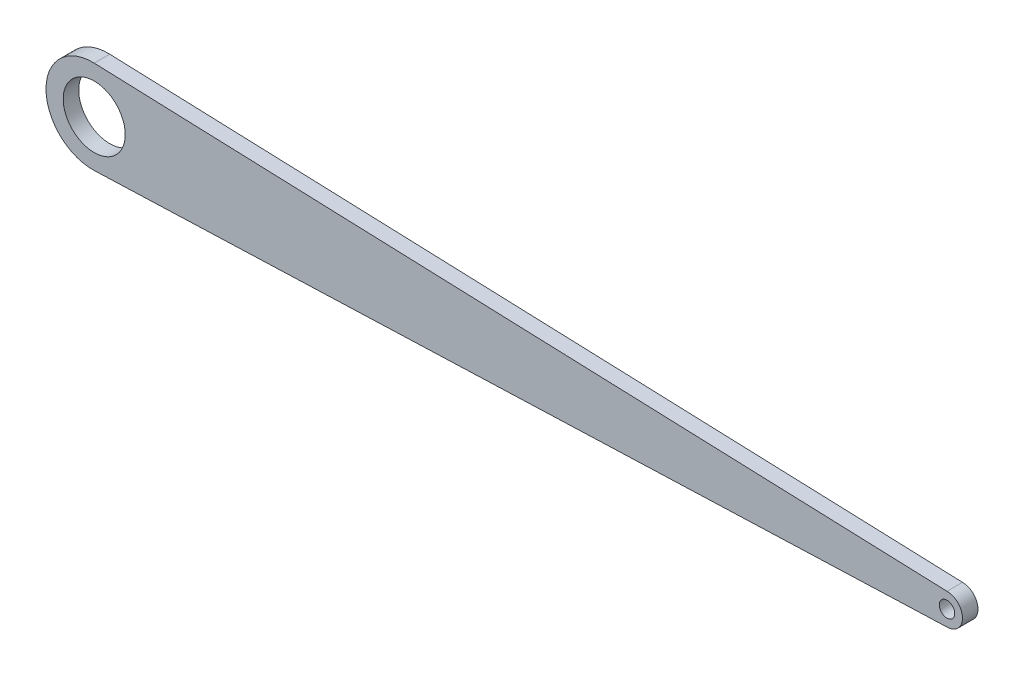
ISO-10303-21;
HEADER;
FILE_DESCRIPTION(('STEP AP214'),'2;1');
FILE_NAME('part.step','',(''),(''),'','','');
FILE_SCHEMA(('AUTOMOTIVE_DESIGN { 1 0 10303 214 1 1 1 1 }'));
ENDSEC;
DATA;
#1=APPLICATION_CONTEXT('core data for automotive mechanical design processes');
#2=APPLICATION_PROTOCOL_DEFINITION('international standard','automotive_design',2000,#1);
#3=PRODUCT_CONTEXT('',#1,'mechanical');
#4=PRODUCT('Part','Part','',(#3));
#5=PRODUCT_RELATED_PRODUCT_CATEGORY('part','',(#4));
#6=PRODUCT_DEFINITION_FORMATION('','',#4);
#7=PRODUCT_DEFINITION_CONTEXT('part definition',#1,'design');
#8=PRODUCT_DEFINITION('design','',#6,#7);
#9=PRODUCT_DEFINITION_SHAPE('','',#8);
#10=(LENGTH_UNIT() NAMED_UNIT(*) SI_UNIT(.MILLI.,.METRE.));
#11=(NAMED_UNIT(*) PLANE_ANGLE_UNIT() SI_UNIT($,.RADIAN.));
#12=(NAMED_UNIT(*) SI_UNIT($,.STERADIAN.) SOLID_ANGLE_UNIT());
#13=UNCERTAINTY_MEASURE_WITH_UNIT(LENGTH_MEASURE(1.E-05),#10,'distance_accuracy_value','');
#14=(GEOMETRIC_REPRESENTATION_CONTEXT(3) GLOBAL_UNCERTAINTY_ASSIGNED_CONTEXT((#13)) GLOBAL_UNIT_ASSIGNED_CONTEXT((#10,
#11,#12)) REPRESENTATION_CONTEXT('',''));
#15=CARTESIAN_POINT('',(0.,0.,0.));
#16=DIRECTION('',(0.,0.,1.));
#17=DIRECTION('',(1.,0.,0.));
#18=AXIS2_PLACEMENT_3D('',#15,#16,#17);
#19=CARTESIAN_POINT('',(137.5,0.,5.));
#20=DIRECTION('',(0.,0.,-1.));
#21=DIRECTION('',(-1.,0.,0.));
#22=AXIS2_PLACEMENT_3D('',#19,#20,#21);
#23=PLANE('',#22);
#24=CARTESIAN_POINT('',(137.5,0.,5.));
#25=DIRECTION('',(0.,0.,1.));
#26=DIRECTION('',(-1.,0.,0.));
#27=AXIS2_PLACEMENT_3D('',#24,#25,#26);
#28=CIRCLE('',#27,5.);
#29=CARTESIAN_POINT('',(137.5,-5.,5.));
#30=VERTEX_POINT('',#29);
#31=CARTESIAN_POINT('',(137.5,5.,5.));
#32=VERTEX_POINT('',#31);
#33=EDGE_CURVE('E92',#30,#32,#28,.T.);
#34=ORIENTED_EDGE('',*,*,#33,.T.);
#35=DIRECTION('',(-0.999339497946432,0.036339618107143,0.));
#36=VECTOR('',#35,1.);
#37=CARTESIAN_POINT('',(-137.5,15.,5.));
#38=LINE('',#37,#36);
#39=CARTESIAN_POINT('',(-137.5,15.,5.));
#40=VERTEX_POINT('',#39);
#41=EDGE_CURVE('E87',#32,#40,#38,.T.);
#42=ORIENTED_EDGE('',*,*,#41,.T.);
#43=CARTESIAN_POINT('',(-138.045454545455,0.,5.));
#44=DIRECTION('',(0.,0.,1.));
#45=DIRECTION('',(1.,0.,0.));
#46=AXIS2_PLACEMENT_3D('',#43,#44,#45);
#47=CIRCLE('',#46,15.0099140790731);
#48=CARTESIAN_POINT('',(-137.5,-15.,5.));
#49=VERTEX_POINT('',#48);
#50=EDGE_CURVE('E90',#40,#49,#47,.T.);
#51=ORIENTED_EDGE('',*,*,#50,.T.);
#52=DIRECTION('',(0.999339497946432,0.036339618107143,0.));
#53=VECTOR('',#52,1.);
#54=CARTESIAN_POINT('',(-137.5,-15.,5.));
#55=LINE('',#54,#53);
#56=EDGE_CURVE('E57',#49,#30,#55,.T.);
#57=ORIENTED_EDGE('',*,*,#56,.T.);
#58=EDGE_LOOP('',(#34,#42,#51,#57));
#59=FACE_BOUND('',#58,.T.);
#60=CARTESIAN_POINT('',(-137.5,0.,5.));
#61=DIRECTION('',(0.,0.,1.));
#62=DIRECTION('',(1.,0.,0.));
#63=AXIS2_PLACEMENT_3D('',#60,#61,#62);
#64=CIRCLE('',#63,10.);
#65=CARTESIAN_POINT('',(-127.5,0.,5.));
#66=VERTEX_POINT('',#65);
#67=EDGE_CURVE('E107',#66,#66,#64,.T.);
#68=ORIENTED_EDGE('',*,*,#67,.F.);
#69=EDGE_LOOP('',(#68));
#70=FACE_BOUND('',#69,.T.);
#71=CARTESIAN_POINT('',(137.5,0.,5.));
#72=DIRECTION('',(0.,0.,1.));
#73=DIRECTION('',(1.,0.,0.));
#74=AXIS2_PLACEMENT_3D('',#71,#72,#73);
#75=CIRCLE('',#74,2.5);
#76=CARTESIAN_POINT('',(140.,0.,5.));
#77=VERTEX_POINT('',#76);
#78=EDGE_CURVE('E122',#77,#77,#75,.T.);
#79=ORIENTED_EDGE('',*,*,#78,.F.);
#80=EDGE_LOOP('',(#79));
#81=FACE_BOUND('',#80,.T.);
#82=ADVANCED_FACE('F40',(#59,#70,#81),#23,.F.);
#83=CARTESIAN_POINT('',(137.5,0.,0.));
#84=DIRECTION('',(0.,0.,-1.));
#85=DIRECTION('',(-1.,0.,0.));
#86=AXIS2_PLACEMENT_3D('',#83,#84,#85);
#87=PLANE('',#86);
#88=CARTESIAN_POINT('',(-137.5,0.,0.));
#89=DIRECTION('',(0.,0.,1.));
#90=DIRECTION('',(1.,0.,0.));
#91=AXIS2_PLACEMENT_3D('',#88,#89,#90);
#92=CIRCLE('',#91,10.);
#93=CARTESIAN_POINT('',(-127.5,0.,0.));
#94=VERTEX_POINT('',#93);
#95=EDGE_CURVE('E119',#94,#94,#92,.T.);
#96=ORIENTED_EDGE('',*,*,#95,.T.);
#97=EDGE_LOOP('',(#96));
#98=FACE_BOUND('',#97,.T.);
#99=CARTESIAN_POINT('',(137.5,0.,0.));
#100=DIRECTION('',(0.,0.,1.));
#101=DIRECTION('',(-1.,0.,0.));
#102=AXIS2_PLACEMENT_3D('',#99,#100,#101);
#103=CIRCLE('',#102,5.);
#104=CARTESIAN_POINT('',(137.5,-5.,0.));
#105=VERTEX_POINT('',#104);
#106=CARTESIAN_POINT('',(137.5,5.,0.));
#107=VERTEX_POINT('',#106);
#108=EDGE_CURVE('E104',#105,#107,#103,.T.);
#109=ORIENTED_EDGE('',*,*,#108,.F.);
#110=DIRECTION('',(0.999339497946432,0.036339618107143,0.));
#111=VECTOR('',#110,1.);
#112=CARTESIAN_POINT('',(-137.5,-15.,0.));
#113=LINE('',#112,#111);
#114=CARTESIAN_POINT('',(-137.5,-15.,0.));
#115=VERTEX_POINT('',#114);
#116=EDGE_CURVE('E80',#115,#105,#113,.T.);
#117=ORIENTED_EDGE('',*,*,#116,.F.);
#118=CARTESIAN_POINT('',(-138.045454545455,0.,0.));
#119=DIRECTION('',(0.,0.,1.));
#120=DIRECTION('',(1.,0.,0.));
#121=AXIS2_PLACEMENT_3D('',#118,#119,#120);
#122=CIRCLE('',#121,15.0099140790731);
#123=CARTESIAN_POINT('',(-137.5,15.,0.));
#124=VERTEX_POINT('',#123);
#125=EDGE_CURVE('E74',#124,#115,#122,.T.);
#126=ORIENTED_EDGE('',*,*,#125,.F.);
#127=DIRECTION('',(-0.999339497946432,0.036339618107143,0.));
#128=VECTOR('',#127,1.);
#129=CARTESIAN_POINT('',(-137.5,15.,0.));
#130=LINE('',#129,#128);
#131=EDGE_CURVE('E96',#107,#124,#130,.T.);
#132=ORIENTED_EDGE('',*,*,#131,.F.);
#133=EDGE_LOOP('',(#109,#117,#126,#132));
#134=FACE_BOUND('',#133,.T.);
#135=CARTESIAN_POINT('',(137.5,0.,0.));
#136=DIRECTION('',(0.,0.,1.));
#137=DIRECTION('',(1.,0.,0.));
#138=AXIS2_PLACEMENT_3D('',#135,#136,#137);
#139=CIRCLE('',#138,2.5);
#140=CARTESIAN_POINT('',(140.,0.,0.));
#141=VERTEX_POINT('',#140);
#142=EDGE_CURVE('E125',#141,#141,#139,.T.);
#143=ORIENTED_EDGE('',*,*,#142,.T.);
#144=EDGE_LOOP('',(#143));
#145=FACE_BOUND('',#144,.T.);
#146=ADVANCED_FACE('F115',(#98,#134,#145),#87,.T.);
#147=CARTESIAN_POINT('',(137.5,0.,5.));
#148=DIRECTION('',(0.,0.,-1.));
#149=DIRECTION('',(-1.,0.,0.));
#150=AXIS2_PLACEMENT_3D('',#147,#148,#149);
#151=CYLINDRICAL_SURFACE('',#150,5.);
#152=ORIENTED_EDGE('',*,*,#108,.T.);
#153=DIRECTION('',(0.,0.,-1.));
#154=VECTOR('',#153,1.);
#155=CARTESIAN_POINT('',(137.5,5.,5.));
#156=LINE('',#155,#154);
#157=EDGE_CURVE('E11',#32,#107,#156,.T.);
#158=ORIENTED_EDGE('',*,*,#157,.F.);
#159=ORIENTED_EDGE('',*,*,#33,.F.);
#160=DIRECTION('',(0.,0.,-1.));
#161=VECTOR('',#160,1.);
#162=CARTESIAN_POINT('',(137.5,-5.,5.));
#163=LINE('',#162,#161);
#164=EDGE_CURVE('E100',#30,#105,#163,.T.);
#165=ORIENTED_EDGE('',*,*,#164,.T.);
#166=EDGE_LOOP('',(#152,#158,#159,#165));
#167=FACE_BOUND('',#166,.T.);
#168=ADVANCED_FACE('F42',(#167),#151,.T.);
#169=CARTESIAN_POINT('',(-137.5,15.,5.));
#170=DIRECTION('',(-0.036339618107143,-0.999339497946432,0.));
#171=DIRECTION('',(0.999339497946432,-0.036339618107143,0.));
#172=AXIS2_PLACEMENT_3D('',#169,#170,#171);
#173=PLANE('',#172);
#174=ORIENTED_EDGE('',*,*,#131,.T.);
#175=DIRECTION('',(0.,0.,-1.));
#176=VECTOR('',#175,1.);
#177=CARTESIAN_POINT('',(-137.5,15.,5.));
#178=LINE('',#177,#176);
#179=EDGE_CURVE('E49',#40,#124,#178,.T.);
#180=ORIENTED_EDGE('',*,*,#179,.F.);
#181=ORIENTED_EDGE('',*,*,#41,.F.);
#182=ORIENTED_EDGE('',*,*,#157,.T.);
#183=EDGE_LOOP('',(#174,#180,#181,#182));
#184=FACE_BOUND('',#183,.T.);
#185=ADVANCED_FACE('F95',(#184),#173,.F.);
#186=CARTESIAN_POINT('',(-138.045454545455,0.,5.));
#187=DIRECTION('',(0.,0.,-1.));
#188=DIRECTION('',(-1.,0.,0.));
#189=AXIS2_PLACEMENT_3D('',#186,#187,#188);
#190=CYLINDRICAL_SURFACE('',#189,15.0099140790731);
#191=ORIENTED_EDGE('',*,*,#125,.T.);
#192=DIRECTION('',(0.,0.,-1.));
#193=VECTOR('',#192,1.);
#194=CARTESIAN_POINT('',(-137.5,-15.,5.));
#195=LINE('',#194,#193);
#196=EDGE_CURVE('E97',#49,#115,#195,.T.);
#197=ORIENTED_EDGE('',*,*,#196,.F.);
#198=ORIENTED_EDGE('',*,*,#50,.F.);
#199=ORIENTED_EDGE('',*,*,#179,.T.);
#200=EDGE_LOOP('',(#191,#197,#198,#199));
#201=FACE_BOUND('',#200,.T.);
#202=ADVANCED_FACE('F98',(#201),#190,.T.);
#203=CARTESIAN_POINT('',(-137.5,-15.,5.));
#204=DIRECTION('',(-0.036339618107143,0.999339497946432,0.));
#205=DIRECTION('',(-0.999339497946432,-0.036339618107143,0.));
#206=AXIS2_PLACEMENT_3D('',#203,#204,#205);
#207=PLANE('',#206);
#208=ORIENTED_EDGE('',*,*,#116,.T.);
#209=ORIENTED_EDGE('',*,*,#164,.F.);
#210=ORIENTED_EDGE('',*,*,#56,.F.);
#211=ORIENTED_EDGE('',*,*,#196,.T.);
#212=EDGE_LOOP('',(#208,#209,#210,#211));
#213=FACE_BOUND('',#212,.T.);
#214=ADVANCED_FACE('F112',(#213),#207,.F.);
#215=CARTESIAN_POINT('',(-137.5,0.,5.));
#216=DIRECTION('',(0.,0.,-1.));
#217=DIRECTION('',(-1.,0.,0.));
#218=AXIS2_PLACEMENT_3D('',#215,#216,#217);
#219=CYLINDRICAL_SURFACE('',#218,10.);
#220=ORIENTED_EDGE('',*,*,#67,.T.);
#221=EDGE_LOOP('',(#220));
#222=FACE_BOUND('',#221,.T.);
#223=ORIENTED_EDGE('',*,*,#95,.F.);
#224=EDGE_LOOP('',(#223));
#225=FACE_BOUND('',#224,.T.);
#226=ADVANCED_FACE('F142',(#222,#225),#219,.F.);
#227=CARTESIAN_POINT('',(137.5,0.,5.));
#228=DIRECTION('',(0.,0.,-1.));
#229=DIRECTION('',(-1.,0.,0.));
#230=AXIS2_PLACEMENT_3D('',#227,#228,#229);
#231=CYLINDRICAL_SURFACE('',#230,2.5);
#232=ORIENTED_EDGE('',*,*,#78,.T.);
#233=EDGE_LOOP('',(#232));
#234=FACE_BOUND('',#233,.T.);
#235=ORIENTED_EDGE('',*,*,#142,.F.);
#236=EDGE_LOOP('',(#235));
#237=FACE_BOUND('',#236,.T.);
#238=ADVANCED_FACE('F131',(#234,#237),#231,.F.);
#239=CLOSED_SHELL('',(#82,#146,#168,#185,#202,#214,#226,#238));
#240=MANIFOLD_SOLID_BREP('B2',#239);
#241=ADVANCED_BREP_SHAPE_REPRESENTATION('',(#18,#240),#14);
#242=SHAPE_DEFINITION_REPRESENTATION(#9,#241);
ENDSEC;
END-ISO-10303-21;
